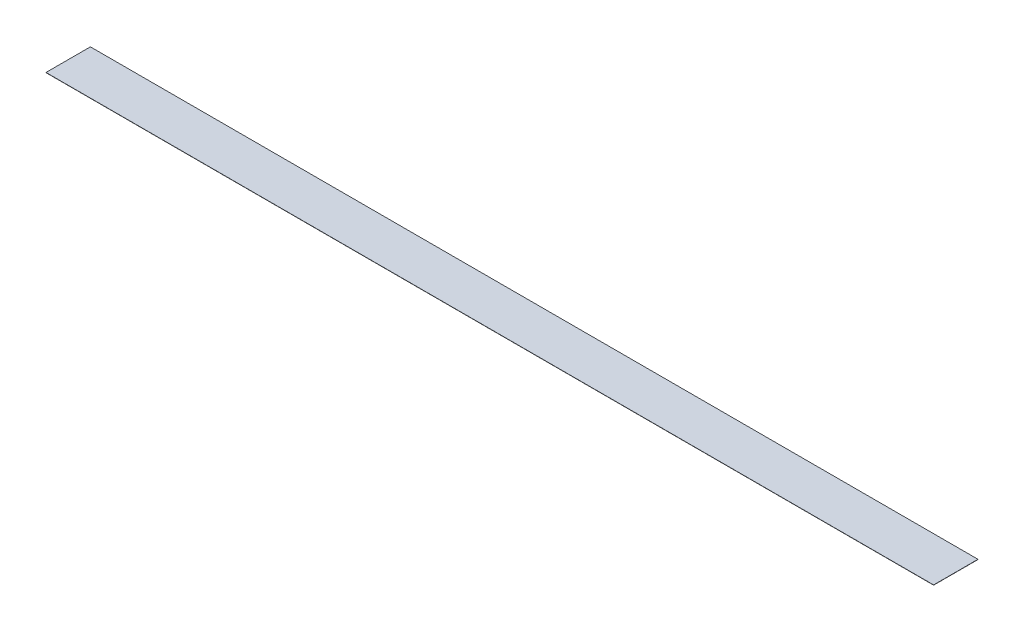
ISO-10303-21;
HEADER;
FILE_DESCRIPTION(('STEP AP214'),'2;1');
FILE_NAME('part.step','',(''),(''),'','','');
FILE_SCHEMA(('AUTOMOTIVE_DESIGN { 1 0 10303 214 1 1 1 1 }'));
ENDSEC;
DATA;
#1=APPLICATION_CONTEXT('core data for automotive mechanical design processes');
#2=APPLICATION_PROTOCOL_DEFINITION('international standard','automotive_design',2000,#1);
#3=PRODUCT_CONTEXT('',#1,'mechanical');
#4=PRODUCT('Part','Part','',(#3));
#5=PRODUCT_RELATED_PRODUCT_CATEGORY('part','',(#4));
#6=PRODUCT_DEFINITION_FORMATION('','',#4);
#7=PRODUCT_DEFINITION_CONTEXT('part definition',#1,'design');
#8=PRODUCT_DEFINITION('design','',#6,#7);
#9=PRODUCT_DEFINITION_SHAPE('','',#8);
#10=(LENGTH_UNIT() NAMED_UNIT(*) SI_UNIT(.MILLI.,.METRE.));
#11=(NAMED_UNIT(*) PLANE_ANGLE_UNIT() SI_UNIT($,.RADIAN.));
#12=(NAMED_UNIT(*) SI_UNIT($,.STERADIAN.) SOLID_ANGLE_UNIT());
#13=UNCERTAINTY_MEASURE_WITH_UNIT(LENGTH_MEASURE(1.E-05),#10,'distance_accuracy_value','');
#14=(GEOMETRIC_REPRESENTATION_CONTEXT(3) GLOBAL_UNCERTAINTY_ASSIGNED_CONTEXT((#13)) GLOBAL_UNIT_ASSIGNED_CONTEXT((#10,
#11,#12)) REPRESENTATION_CONTEXT('',''));
#15=CARTESIAN_POINT('',(0.,0.,0.));
#16=DIRECTION('',(0.,0.,1.));
#17=DIRECTION('',(1.,0.,0.));
#18=AXIS2_PLACEMENT_3D('',#15,#16,#17);
#19=CARTESIAN_POINT('',(508.,0.254,-25.4));
#20=DIRECTION('',(-1.,0.,0.));
#21=DIRECTION('',(0.,0.,1.));
#22=AXIS2_PLACEMENT_3D('',#19,#20,#21);
#23=PLANE('',#22);
#24=DIRECTION('',(0.,0.,-1.));
#25=VECTOR('',#24,1.);
#26=CARTESIAN_POINT('',(508.,0.,-25.4));
#27=LINE('',#26,#25);
#28=CARTESIAN_POINT('',(508.,0.,25.4));
#29=VERTEX_POINT('',#28);
#30=CARTESIAN_POINT('',(508.,0.,-25.4));
#31=VERTEX_POINT('',#30);
#32=EDGE_CURVE('E104',#29,#31,#27,.T.);
#33=ORIENTED_EDGE('',*,*,#32,.T.);
#34=DIRECTION('',(0.,-1.,0.));
#35=VECTOR('',#34,1.);
#36=CARTESIAN_POINT('',(508.,0.254,-25.4));
#37=LINE('',#36,#35);
#38=CARTESIAN_POINT('',(508.,0.254,-25.4));
#39=VERTEX_POINT('',#38);
#40=EDGE_CURVE('E11',#39,#31,#37,.T.);
#41=ORIENTED_EDGE('',*,*,#40,.F.);
#42=DIRECTION('',(0.,0.,-1.));
#43=VECTOR('',#42,1.);
#44=CARTESIAN_POINT('',(508.,0.254,-25.4));
#45=LINE('',#44,#43);
#46=CARTESIAN_POINT('',(508.,0.254,25.4));
#47=VERTEX_POINT('',#46);
#48=EDGE_CURVE('E92',#47,#39,#45,.T.);
#49=ORIENTED_EDGE('',*,*,#48,.F.);
#50=DIRECTION('',(0.,-1.,0.));
#51=VECTOR('',#50,1.);
#52=CARTESIAN_POINT('',(508.,0.254,25.4));
#53=LINE('',#52,#51);
#54=EDGE_CURVE('E100',#47,#29,#53,.T.);
#55=ORIENTED_EDGE('',*,*,#54,.T.);
#56=EDGE_LOOP('',(#33,#41,#49,#55));
#57=FACE_BOUND('',#56,.T.);
#58=ADVANCED_FACE('F41',(#57),#23,.F.);
#59=CARTESIAN_POINT('',(-508.,0.254,-25.4));
#60=DIRECTION('',(0.,0.,1.));
#61=DIRECTION('',(1.,0.,0.));
#62=AXIS2_PLACEMENT_3D('',#59,#60,#61);
#63=PLANE('',#62);
#64=DIRECTION('',(-1.,0.,0.));
#65=VECTOR('',#64,1.);
#66=CARTESIAN_POINT('',(-508.,0.,-25.4));
#67=LINE('',#66,#65);
#68=CARTESIAN_POINT('',(-508.,0.,-25.4));
#69=VERTEX_POINT('',#68);
#70=EDGE_CURVE('E96',#31,#69,#67,.T.);
#71=ORIENTED_EDGE('',*,*,#70,.T.);
#72=DIRECTION('',(0.,-1.,0.));
#73=VECTOR('',#72,1.);
#74=CARTESIAN_POINT('',(-508.,0.254,-25.4));
#75=LINE('',#74,#73);
#76=CARTESIAN_POINT('',(-508.,0.254,-25.4));
#77=VERTEX_POINT('',#76);
#78=EDGE_CURVE('E49',#77,#69,#75,.T.);
#79=ORIENTED_EDGE('',*,*,#78,.F.);
#80=DIRECTION('',(-1.,0.,0.));
#81=VECTOR('',#80,1.);
#82=CARTESIAN_POINT('',(-508.,0.254,-25.4));
#83=LINE('',#82,#81);
#84=EDGE_CURVE('E87',#39,#77,#83,.T.);
#85=ORIENTED_EDGE('',*,*,#84,.F.);
#86=ORIENTED_EDGE('',*,*,#40,.T.);
#87=EDGE_LOOP('',(#71,#79,#85,#86));
#88=FACE_BOUND('',#87,.T.);
#89=ADVANCED_FACE('F95',(#88),#63,.F.);
#90=CARTESIAN_POINT('',(-508.,0.254,-25.4));
#91=DIRECTION('',(1.,0.,0.));
#92=DIRECTION('',(0.,0.,-1.));
#93=AXIS2_PLACEMENT_3D('',#90,#91,#92);
#94=PLANE('',#93);
#95=DIRECTION('',(0.,0.,1.));
#96=VECTOR('',#95,1.);
#97=CARTESIAN_POINT('',(-508.,0.,-25.4));
#98=LINE('',#97,#96);
#99=CARTESIAN_POINT('',(-508.,0.,25.4));
#100=VERTEX_POINT('',#99);
#101=EDGE_CURVE('E74',#69,#100,#98,.T.);
#102=ORIENTED_EDGE('',*,*,#101,.T.);
#103=DIRECTION('',(0.,-1.,0.));
#104=VECTOR('',#103,1.);
#105=CARTESIAN_POINT('',(-508.,0.254,25.4));
#106=LINE('',#105,#104);
#107=CARTESIAN_POINT('',(-508.,0.254,25.4));
#108=VERTEX_POINT('',#107);
#109=EDGE_CURVE('E97',#108,#100,#106,.T.);
#110=ORIENTED_EDGE('',*,*,#109,.F.);
#111=DIRECTION('',(0.,0.,1.));
#112=VECTOR('',#111,1.);
#113=CARTESIAN_POINT('',(-508.,0.254,-25.4));
#114=LINE('',#113,#112);
#115=EDGE_CURVE('E90',#77,#108,#114,.T.);
#116=ORIENTED_EDGE('',*,*,#115,.F.);
#117=ORIENTED_EDGE('',*,*,#78,.T.);
#118=EDGE_LOOP('',(#102,#110,#116,#117));
#119=FACE_BOUND('',#118,.T.);
#120=ADVANCED_FACE('F98',(#119),#94,.F.);
#121=CARTESIAN_POINT('',(-508.,0.254,25.4));
#122=DIRECTION('',(0.,0.,-1.));
#123=DIRECTION('',(-1.,0.,0.));
#124=AXIS2_PLACEMENT_3D('',#121,#122,#123);
#125=PLANE('',#124);
#126=DIRECTION('',(1.,0.,0.));
#127=VECTOR('',#126,1.);
#128=CARTESIAN_POINT('',(-508.,0.,25.4));
#129=LINE('',#128,#127);
#130=EDGE_CURVE('E80',#100,#29,#129,.T.);
#131=ORIENTED_EDGE('',*,*,#130,.T.);
#132=ORIENTED_EDGE('',*,*,#54,.F.);
#133=DIRECTION('',(1.,0.,0.));
#134=VECTOR('',#133,1.);
#135=CARTESIAN_POINT('',(-508.,0.254,25.4));
#136=LINE('',#135,#134);
#137=EDGE_CURVE('E57',#108,#47,#136,.T.);
#138=ORIENTED_EDGE('',*,*,#137,.F.);
#139=ORIENTED_EDGE('',*,*,#109,.T.);
#140=EDGE_LOOP('',(#131,#132,#138,#139));
#141=FACE_BOUND('',#140,.T.);
#142=ADVANCED_FACE('F111',(#141),#125,.F.);
#143=CARTESIAN_POINT('',(0.,0.254,0.));
#144=DIRECTION('',(0.,1.,0.));
#145=DIRECTION('',(0.,0.,1.));
#146=AXIS2_PLACEMENT_3D('',#143,#144,#145);
#147=PLANE('',#146);
#148=ORIENTED_EDGE('',*,*,#48,.T.);
#149=ORIENTED_EDGE('',*,*,#84,.T.);
#150=ORIENTED_EDGE('',*,*,#115,.T.);
#151=ORIENTED_EDGE('',*,*,#137,.T.);
#152=EDGE_LOOP('',(#148,#149,#150,#151));
#153=FACE_BOUND('',#152,.T.);
#154=ADVANCED_FACE('F88',(#153),#147,.T.);
#155=CARTESIAN_POINT('',(0.,0.,0.));
#156=DIRECTION('',(0.,1.,0.));
#157=DIRECTION('',(0.,0.,1.));
#158=AXIS2_PLACEMENT_3D('',#155,#156,#157);
#159=PLANE('',#158);
#160=ORIENTED_EDGE('',*,*,#32,.F.);
#161=ORIENTED_EDGE('',*,*,#130,.F.);
#162=ORIENTED_EDGE('',*,*,#101,.F.);
#163=ORIENTED_EDGE('',*,*,#70,.F.);
#164=EDGE_LOOP('',(#160,#161,#162,#163));
#165=FACE_BOUND('',#164,.T.);
#166=ADVANCED_FACE('F114',(#165),#159,.F.);
#167=CLOSED_SHELL('',(#58,#89,#120,#142,#154,#166));
#168=MANIFOLD_SOLID_BREP('B2',#167);
#169=ADVANCED_BREP_SHAPE_REPRESENTATION('',(#18,#168),#14);
#170=SHAPE_DEFINITION_REPRESENTATION(#9,#169);
ENDSEC;
END-ISO-10303-21;
